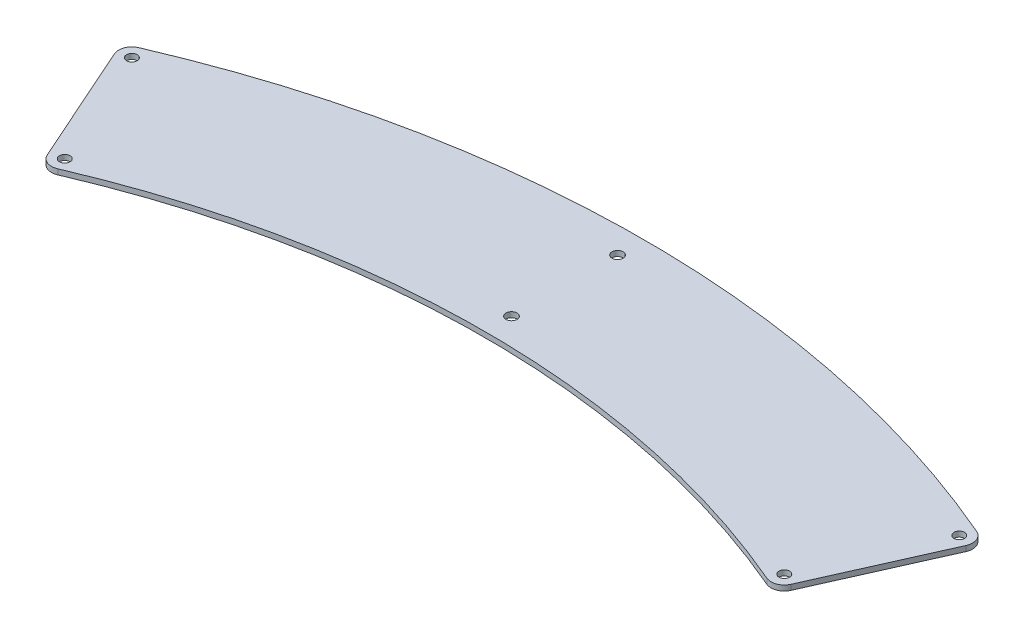
ISO-10303-21;
HEADER;
FILE_DESCRIPTION(('STEP AP214'),'2;1');
FILE_NAME('part.step','',(''),(''),'','','');
FILE_SCHEMA(('AUTOMOTIVE_DESIGN { 1 0 10303 214 1 1 1 1 }'));
ENDSEC;
DATA;
#1=APPLICATION_CONTEXT('core data for automotive mechanical design processes');
#2=APPLICATION_PROTOCOL_DEFINITION('international standard','automotive_design',2000,#1);
#3=PRODUCT_CONTEXT('',#1,'mechanical');
#4=PRODUCT('Part','Part','',(#3));
#5=PRODUCT_RELATED_PRODUCT_CATEGORY('part','',(#4));
#6=PRODUCT_DEFINITION_FORMATION('','',#4);
#7=PRODUCT_DEFINITION_CONTEXT('part definition',#1,'design');
#8=PRODUCT_DEFINITION('design','',#6,#7);
#9=PRODUCT_DEFINITION_SHAPE('','',#8);
#10=(LENGTH_UNIT() NAMED_UNIT(*) SI_UNIT(.MILLI.,.METRE.));
#11=(NAMED_UNIT(*) PLANE_ANGLE_UNIT() SI_UNIT($,.RADIAN.));
#12=(NAMED_UNIT(*) SI_UNIT($,.STERADIAN.) SOLID_ANGLE_UNIT());
#13=UNCERTAINTY_MEASURE_WITH_UNIT(LENGTH_MEASURE(1.E-05),#10,'distance_accuracy_value','');
#14=(GEOMETRIC_REPRESENTATION_CONTEXT(3) GLOBAL_UNCERTAINTY_ASSIGNED_CONTEXT((#13)) GLOBAL_UNIT_ASSIGNED_CONTEXT((#10,
#11,#12)) REPRESENTATION_CONTEXT('',''));
#15=CARTESIAN_POINT('',(0.,0.,0.));
#16=DIRECTION('',(0.,0.,1.));
#17=DIRECTION('',(1.,0.,0.));
#18=AXIS2_PLACEMENT_3D('',#15,#16,#17);
#19=CARTESIAN_POINT('',(0.,-2.,0.));
#20=DIRECTION('',(0.,1.,0.));
#21=DIRECTION('',(0.,0.,1.));
#22=AXIS2_PLACEMENT_3D('',#19,#20,#21);
#23=CYLINDRICAL_SURFACE('',#22,340.);
#24=CARTESIAN_POINT('',(0.,-2.,0.));
#25=DIRECTION('',(0.,-1.,0.));
#26=DIRECTION('',(0.,0.,1.));
#27=AXIS2_PLACEMENT_3D('',#24,#25,#26);
#28=CIRCLE('',#27,340.);
#29=CARTESIAN_POINT('',(-133.77440628349,-2.,-312.577043660439));
#30=VERTEX_POINT('',#29);
#31=CARTESIAN_POINT('',(133.77440628349,-2.,-312.577043660439));
#32=VERTEX_POINT('',#31);
#33=EDGE_CURVE('E160',#30,#32,#28,.T.);
#34=ORIENTED_EDGE('',*,*,#33,.T.);
#35=DIRECTION('',(0.,1.,0.));
#36=VECTOR('',#35,1.);
#37=CARTESIAN_POINT('',(133.77440628349,-2.,-312.577043660439));
#38=LINE('',#37,#36);
#39=CARTESIAN_POINT('',(133.77440628349,0.,-312.577043660439));
#40=VERTEX_POINT('',#39);
#41=EDGE_CURVE('E153',#32,#40,#38,.T.);
#42=ORIENTED_EDGE('',*,*,#41,.T.);
#43=CARTESIAN_POINT('',(0.,0.,0.));
#44=DIRECTION('',(0.,-1.,0.));
#45=DIRECTION('',(0.,0.,1.));
#46=AXIS2_PLACEMENT_3D('',#43,#44,#45);
#47=CIRCLE('',#46,340.);
#48=CARTESIAN_POINT('',(-133.77440628349,0.,-312.577043660439));
#49=VERTEX_POINT('',#48);
#50=EDGE_CURVE('E106',#49,#40,#47,.T.);
#51=ORIENTED_EDGE('',*,*,#50,.F.);
#52=DIRECTION('',(0.,1.,0.));
#53=VECTOR('',#52,1.);
#54=CARTESIAN_POINT('',(-133.77440628349,-2.,-312.577043660439));
#55=LINE('',#54,#53);
#56=EDGE_CURVE('E151',#49,#30,#55,.F.);
#57=ORIENTED_EDGE('',*,*,#56,.T.);
#58=EDGE_LOOP('',(#34,#42,#51,#57));
#59=FACE_BOUND('',#58,.T.);
#60=ADVANCED_FACE('F36',(#59),#23,.F.);
#61=CARTESIAN_POINT('',(-138.29045864577,-2.,-310.605455598485));
#62=DIRECTION('',(-0.913545457642601,0.,0.406736643075801));
#63=DIRECTION('',(0.406736643075801,0.,0.913545457642601));
#64=AXIS2_PLACEMENT_3D('',#61,#62,#63);
#65=PLANE('',#64);
#66=DIRECTION('',(0.406736643075801,0.,0.913545457642601));
#67=VECTOR('',#66,1.);
#68=CARTESIAN_POINT('',(-138.29045864577,0.,-310.605455598485));
#69=LINE('',#68,#67);
#70=CARTESIAN_POINT('',(-160.648102086543,0.,-360.8215449443));
#71=VERTEX_POINT('',#70);
#72=CARTESIAN_POINT('',(-140.309404252343,0.,-315.14008167536));
#73=VERTEX_POINT('',#72);
#74=EDGE_CURVE('E134',#71,#73,#69,.T.);
#75=ORIENTED_EDGE('',*,*,#74,.F.);
#76=DIRECTION('',(0.,1.,0.));
#77=VECTOR('',#76,1.);
#78=CARTESIAN_POINT('',(-160.648102086543,-2.,-360.8215449443));
#79=LINE('',#78,#77);
#80=CARTESIAN_POINT('',(-160.648102086543,-2.,-360.8215449443));
#81=VERTEX_POINT('',#80);
#82=EDGE_CURVE('E11',#71,#81,#79,.F.);
#83=ORIENTED_EDGE('',*,*,#82,.T.);
#84=DIRECTION('',(0.406736643075801,0.,0.913545457642601));
#85=VECTOR('',#84,1.);
#86=CARTESIAN_POINT('',(-138.29045864577,-2.,-310.605455598485));
#87=LINE('',#86,#85);
#88=CARTESIAN_POINT('',(-140.309404252343,-2.,-315.14008167536));
#89=VERTEX_POINT('',#88);
#90=EDGE_CURVE('E127',#81,#89,#87,.T.);
#91=ORIENTED_EDGE('',*,*,#90,.T.);
#92=DIRECTION('',(0.,1.,0.));
#93=VECTOR('',#92,1.);
#94=CARTESIAN_POINT('',(-140.309404252343,-2.,-315.14008167536));
#95=LINE('',#94,#93);
#96=EDGE_CURVE('E44',#89,#73,#95,.T.);
#97=ORIENTED_EDGE('',*,*,#96,.T.);
#98=EDGE_LOOP('',(#75,#83,#91,#97));
#99=FACE_BOUND('',#98,.T.);
#100=ADVANCED_FACE('F157',(#99),#65,.T.);
#101=CARTESIAN_POINT('',(0.,-2.,0.));
#102=DIRECTION('',(0.,1.,0.));
#103=DIRECTION('',(0.,0.,1.));
#104=AXIS2_PLACEMENT_3D('',#101,#102,#103);
#105=CYLINDRICAL_SURFACE('',#104,400.);
#106=CARTESIAN_POINT('',(0.,0.,0.));
#107=DIRECTION('',(0.,1.,0.));
#108=DIRECTION('',(0.,0.,1.));
#109=AXIS2_PLACEMENT_3D('',#106,#107,#108);
#110=CIRCLE('',#109,400.);
#111=CARTESIAN_POINT('',(158.056075745144,0.,-367.448332313599));
#112=VERTEX_POINT('',#111);
#113=CARTESIAN_POINT('',(-158.056075745144,0.,-367.448332313599));
#114=VERTEX_POINT('',#113);
#115=EDGE_CURVE('E122',#112,#114,#110,.T.);
#116=ORIENTED_EDGE('',*,*,#115,.F.);
#117=DIRECTION('',(0.,1.,0.));
#118=VECTOR('',#117,1.);
#119=CARTESIAN_POINT('',(158.056075745144,-2.,-367.448332313599));
#120=LINE('',#119,#118);
#121=CARTESIAN_POINT('',(158.056075745144,-2.,-367.448332313599));
#122=VERTEX_POINT('',#121);
#123=EDGE_CURVE('E143',#112,#122,#120,.F.);
#124=ORIENTED_EDGE('',*,*,#123,.T.);
#125=CARTESIAN_POINT('',(0.,-2.,0.));
#126=DIRECTION('',(0.,1.,0.));
#127=DIRECTION('',(0.,0.,1.));
#128=AXIS2_PLACEMENT_3D('',#125,#126,#127);
#129=CIRCLE('',#128,400.);
#130=CARTESIAN_POINT('',(-158.056075745144,-2.,-367.448332313599));
#131=VERTEX_POINT('',#130);
#132=EDGE_CURVE('E131',#122,#131,#129,.T.);
#133=ORIENTED_EDGE('',*,*,#132,.T.);
#134=DIRECTION('',(0.,1.,0.));
#135=VECTOR('',#134,1.);
#136=CARTESIAN_POINT('',(-158.056075745144,-2.,-367.448332313599));
#137=LINE('',#136,#135);
#138=EDGE_CURVE('E140',#131,#114,#137,.T.);
#139=ORIENTED_EDGE('',*,*,#138,.T.);
#140=EDGE_LOOP('',(#116,#124,#133,#139));
#141=FACE_BOUND('',#140,.T.);
#142=ADVANCED_FACE('F242',(#141),#105,.T.);
#143=CARTESIAN_POINT('',(162.694657230318,-2.,-365.418183057042));
#144=DIRECTION('',(0.913545457642603,0.,0.406736643075795));
#145=DIRECTION('',(0.406736643075795,0.,-0.913545457642603));
#146=AXIS2_PLACEMENT_3D('',#143,#144,#145);
#147=PLANE('',#146);
#148=DIRECTION('',(0.406736643075795,0.,-0.913545457642603));
#149=VECTOR('',#148,1.);
#150=CARTESIAN_POINT('',(162.694657230318,-2.,-365.418183057042));
#151=LINE('',#150,#149);
#152=CARTESIAN_POINT('',(140.309404252343,-2.,-315.14008167536));
#153=VERTEX_POINT('',#152);
#154=CARTESIAN_POINT('',(160.648102086543,-2.,-360.8215449443));
#155=VERTEX_POINT('',#154);
#156=EDGE_CURVE('E162',#153,#155,#151,.T.);
#157=ORIENTED_EDGE('',*,*,#156,.T.);
#158=DIRECTION('',(0.,1.,0.));
#159=VECTOR('',#158,1.);
#160=CARTESIAN_POINT('',(160.648102086543,-2.,-360.8215449443));
#161=LINE('',#160,#159);
#162=CARTESIAN_POINT('',(160.648102086543,0.,-360.8215449443));
#163=VERTEX_POINT('',#162);
#164=EDGE_CURVE('E121',#155,#163,#161,.T.);
#165=ORIENTED_EDGE('',*,*,#164,.T.);
#166=DIRECTION('',(0.406736643075795,0.,-0.913545457642603));
#167=VECTOR('',#166,1.);
#168=CARTESIAN_POINT('',(162.694657230318,0.,-365.418183057042));
#169=LINE('',#168,#167);
#170=CARTESIAN_POINT('',(140.309404252343,0.,-315.14008167536));
#171=VERTEX_POINT('',#170);
#172=EDGE_CURVE('E104',#171,#163,#169,.T.);
#173=ORIENTED_EDGE('',*,*,#172,.F.);
#174=DIRECTION('',(0.,1.,0.));
#175=VECTOR('',#174,1.);
#176=CARTESIAN_POINT('',(140.309404252343,-2.,-315.14008167536));
#177=LINE('',#176,#175);
#178=EDGE_CURVE('E118',#171,#153,#177,.F.);
#179=ORIENTED_EDGE('',*,*,#178,.T.);
#180=EDGE_LOOP('',(#157,#165,#173,#179));
#181=FACE_BOUND('',#180,.T.);
#182=ADVANCED_FACE('F117',(#181),#147,.T.);
#183=CARTESIAN_POINT('',(0.,-2.,0.));
#184=DIRECTION('',(0.,1.,0.));
#185=DIRECTION('',(0.,0.,1.));
#186=AXIS2_PLACEMENT_3D('',#183,#184,#185);
#187=PLANE('',#186);
#188=CARTESIAN_POINT('',(156.08037479833,-2.,-362.855228159679));
#189=DIRECTION('',(0.,1.,0.));
#190=DIRECTION('',(0.,0.,1.));
#191=AXIS2_PLACEMENT_3D('',#188,#189,#190);
#192=CIRCLE('',#191,2.);
#193=CARTESIAN_POINT('',(156.08037479833,-2.,-360.855228159679));
#194=VERTEX_POINT('',#193);
#195=EDGE_CURVE('E200',#194,#194,#192,.T.);
#196=ORIENTED_EDGE('',*,*,#195,.T.);
#197=EDGE_LOOP('',(#196));
#198=FACE_BOUND('',#197,.T.);
#199=CARTESIAN_POINT('',(135.74167696413,-2.,-317.173764890739));
#200=DIRECTION('',(0.,1.,0.));
#201=DIRECTION('',(0.,0.,1.));
#202=AXIS2_PLACEMENT_3D('',#199,#200,#201);
#203=CIRCLE('',#202,2.);
#204=CARTESIAN_POINT('',(135.74167696413,-2.,-315.173764890739));
#205=VERTEX_POINT('',#204);
#206=EDGE_CURVE('E194',#205,#205,#203,.T.);
#207=ORIENTED_EDGE('',*,*,#206,.T.);
#208=EDGE_LOOP('',(#207));
#209=FACE_BOUND('',#208,.T.);
#210=CARTESIAN_POINT('',(-156.08037479833,-2.,-362.855228159679));
#211=DIRECTION('',(0.,1.,0.));
#212=DIRECTION('',(0.,0.,1.));
#213=AXIS2_PLACEMENT_3D('',#210,#211,#212);
#214=CIRCLE('',#213,2.);
#215=CARTESIAN_POINT('',(-156.08037479833,-2.,-360.855228159679));
#216=VERTEX_POINT('',#215);
#217=EDGE_CURVE('E188',#216,#216,#214,.T.);
#218=ORIENTED_EDGE('',*,*,#217,.T.);
#219=EDGE_LOOP('',(#218));
#220=FACE_BOUND('',#219,.T.);
#221=CARTESIAN_POINT('',(-135.741676964129,-2.,-317.173764890739));
#222=DIRECTION('',(0.,1.,0.));
#223=DIRECTION('',(0.,0.,1.));
#224=AXIS2_PLACEMENT_3D('',#221,#222,#223);
#225=CIRCLE('',#224,2.);
#226=CARTESIAN_POINT('',(-135.741676964129,-2.,-315.173764890739));
#227=VERTEX_POINT('',#226);
#228=EDGE_CURVE('E182',#227,#227,#225,.T.);
#229=ORIENTED_EDGE('',*,*,#228,.T.);
#230=EDGE_LOOP('',(#229));
#231=FACE_BOUND('',#230,.T.);
#232=CARTESIAN_POINT('',(0.,-2.,-390.));
#233=DIRECTION('',(0.,1.,0.));
#234=DIRECTION('',(0.,0.,1.));
#235=AXIS2_PLACEMENT_3D('',#232,#233,#234);
#236=CIRCLE('',#235,2.09999999999999);
#237=CARTESIAN_POINT('',(0.,-2.,-387.9));
#238=VERTEX_POINT('',#237);
#239=EDGE_CURVE('E176',#238,#238,#236,.T.);
#240=ORIENTED_EDGE('',*,*,#239,.T.);
#241=EDGE_LOOP('',(#240));
#242=FACE_BOUND('',#241,.T.);
#243=CARTESIAN_POINT('',(0.,-2.,-350.));
#244=DIRECTION('',(0.,1.,0.));
#245=DIRECTION('',(0.,0.,1.));
#246=AXIS2_PLACEMENT_3D('',#243,#244,#245);
#247=CIRCLE('',#246,2.10000000000001);
#248=CARTESIAN_POINT('',(0.,-2.,-347.9));
#249=VERTEX_POINT('',#248);
#250=EDGE_CURVE('E166',#249,#249,#247,.T.);
#251=ORIENTED_EDGE('',*,*,#250,.T.);
#252=EDGE_LOOP('',(#251));
#253=FACE_BOUND('',#252,.T.);
#254=ORIENTED_EDGE('',*,*,#132,.F.);
#255=CARTESIAN_POINT('',(156.08037479833,-2.,-362.855228159679));
#256=DIRECTION('',(0.,1.,0.));
#257=DIRECTION('',(0.,0.,1.));
#258=AXIS2_PLACEMENT_3D('',#255,#256,#257);
#259=CIRCLE('',#258,5.);
#260=EDGE_CURVE('E149',#122,#155,#259,.F.);
#261=ORIENTED_EDGE('',*,*,#260,.T.);
#262=ORIENTED_EDGE('',*,*,#156,.F.);
#263=CARTESIAN_POINT('',(135.74167696413,-2.,-317.173764890739));
#264=DIRECTION('',(0.,1.,0.));
#265=DIRECTION('',(0.,0.,1.));
#266=AXIS2_PLACEMENT_3D('',#263,#264,#265);
#267=CIRCLE('',#266,5.);
#268=EDGE_CURVE('E126',#153,#32,#267,.F.);
#269=ORIENTED_EDGE('',*,*,#268,.T.);
#270=ORIENTED_EDGE('',*,*,#33,.F.);
#271=CARTESIAN_POINT('',(-135.74167696413,-2.,-317.173764890739));
#272=DIRECTION('',(0.,1.,0.));
#273=DIRECTION('',(0.,0.,1.));
#274=AXIS2_PLACEMENT_3D('',#271,#272,#273);
#275=CIRCLE('',#274,5.);
#276=EDGE_CURVE('E51',#30,#89,#275,.F.);
#277=ORIENTED_EDGE('',*,*,#276,.T.);
#278=ORIENTED_EDGE('',*,*,#90,.F.);
#279=CARTESIAN_POINT('',(-156.08037479833,-2.,-362.855228159679));
#280=DIRECTION('',(0.,1.,0.));
#281=DIRECTION('',(0.,0.,1.));
#282=AXIS2_PLACEMENT_3D('',#279,#280,#281);
#283=CIRCLE('',#282,5.);
#284=EDGE_CURVE('E146',#81,#131,#283,.F.);
#285=ORIENTED_EDGE('',*,*,#284,.T.);
#286=EDGE_LOOP('',(#254,#261,#262,#269,#270,#277,#278,#285));
#287=FACE_BOUND('',#286,.T.);
#288=ADVANCED_FACE('F213',(#198,#209,#220,#231,#242,#253,#287),#187,.F.);
#289=CARTESIAN_POINT('',(0.,0.,0.));
#290=DIRECTION('',(0.,1.,0.));
#291=DIRECTION('',(0.,0.,1.));
#292=AXIS2_PLACEMENT_3D('',#289,#290,#291);
#293=PLANE('',#292);
#294=CARTESIAN_POINT('',(156.08037479833,0.,-362.855228159679));
#295=DIRECTION('',(0.,1.,0.));
#296=DIRECTION('',(0.,0.,1.));
#297=AXIS2_PLACEMENT_3D('',#294,#295,#296);
#298=CIRCLE('',#297,2.);
#299=CARTESIAN_POINT('',(156.08037479833,0.,-360.855228159679));
#300=VERTEX_POINT('',#299);
#301=EDGE_CURVE('E203',#300,#300,#298,.T.);
#302=ORIENTED_EDGE('',*,*,#301,.F.);
#303=EDGE_LOOP('',(#302));
#304=FACE_BOUND('',#303,.T.);
#305=CARTESIAN_POINT('',(135.74167696413,0.,-317.173764890739));
#306=DIRECTION('',(0.,1.,0.));
#307=DIRECTION('',(0.,0.,1.));
#308=AXIS2_PLACEMENT_3D('',#305,#306,#307);
#309=CIRCLE('',#308,2.);
#310=CARTESIAN_POINT('',(135.74167696413,0.,-315.173764890739));
#311=VERTEX_POINT('',#310);
#312=EDGE_CURVE('E197',#311,#311,#309,.T.);
#313=ORIENTED_EDGE('',*,*,#312,.F.);
#314=EDGE_LOOP('',(#313));
#315=FACE_BOUND('',#314,.T.);
#316=CARTESIAN_POINT('',(-156.08037479833,0.,-362.855228159679));
#317=DIRECTION('',(0.,1.,0.));
#318=DIRECTION('',(0.,0.,1.));
#319=AXIS2_PLACEMENT_3D('',#316,#317,#318);
#320=CIRCLE('',#319,2.);
#321=CARTESIAN_POINT('',(-156.08037479833,0.,-360.855228159679));
#322=VERTEX_POINT('',#321);
#323=EDGE_CURVE('E191',#322,#322,#320,.T.);
#324=ORIENTED_EDGE('',*,*,#323,.F.);
#325=EDGE_LOOP('',(#324));
#326=FACE_BOUND('',#325,.T.);
#327=CARTESIAN_POINT('',(-135.741676964129,0.,-317.173764890739));
#328=DIRECTION('',(0.,1.,0.));
#329=DIRECTION('',(0.,0.,1.));
#330=AXIS2_PLACEMENT_3D('',#327,#328,#329);
#331=CIRCLE('',#330,2.);
#332=CARTESIAN_POINT('',(-135.741676964129,0.,-315.173764890739));
#333=VERTEX_POINT('',#332);
#334=EDGE_CURVE('E185',#333,#333,#331,.T.);
#335=ORIENTED_EDGE('',*,*,#334,.F.);
#336=EDGE_LOOP('',(#335));
#337=FACE_BOUND('',#336,.T.);
#338=CARTESIAN_POINT('',(0.,0.,-390.));
#339=DIRECTION('',(0.,1.,0.));
#340=DIRECTION('',(0.,0.,1.));
#341=AXIS2_PLACEMENT_3D('',#338,#339,#340);
#342=CIRCLE('',#341,2.09999999999999);
#343=CARTESIAN_POINT('',(0.,0.,-387.9));
#344=VERTEX_POINT('',#343);
#345=EDGE_CURVE('E179',#344,#344,#342,.T.);
#346=ORIENTED_EDGE('',*,*,#345,.F.);
#347=EDGE_LOOP('',(#346));
#348=FACE_BOUND('',#347,.T.);
#349=CARTESIAN_POINT('',(0.,0.,-350.));
#350=DIRECTION('',(0.,1.,0.));
#351=DIRECTION('',(0.,0.,1.));
#352=AXIS2_PLACEMENT_3D('',#349,#350,#351);
#353=CIRCLE('',#352,2.10000000000001);
#354=CARTESIAN_POINT('',(0.,0.,-347.9));
#355=VERTEX_POINT('',#354);
#356=EDGE_CURVE('E173',#355,#355,#353,.T.);
#357=ORIENTED_EDGE('',*,*,#356,.F.);
#358=EDGE_LOOP('',(#357));
#359=FACE_BOUND('',#358,.T.);
#360=ORIENTED_EDGE('',*,*,#172,.T.);
#361=CARTESIAN_POINT('',(156.08037479833,0.,-362.855228159679));
#362=DIRECTION('',(0.,1.,0.));
#363=DIRECTION('',(0.,0.,1.));
#364=AXIS2_PLACEMENT_3D('',#361,#362,#363);
#365=CIRCLE('',#364,5.);
#366=EDGE_CURVE('E111',#163,#112,#365,.T.);
#367=ORIENTED_EDGE('',*,*,#366,.T.);
#368=ORIENTED_EDGE('',*,*,#115,.T.);
#369=CARTESIAN_POINT('',(-156.08037479833,0.,-362.855228159679));
#370=DIRECTION('',(0.,1.,0.));
#371=DIRECTION('',(0.,0.,1.));
#372=AXIS2_PLACEMENT_3D('',#369,#370,#371);
#373=CIRCLE('',#372,5.);
#374=EDGE_CURVE('E112',#114,#71,#373,.T.);
#375=ORIENTED_EDGE('',*,*,#374,.T.);
#376=ORIENTED_EDGE('',*,*,#74,.T.);
#377=CARTESIAN_POINT('',(-135.74167696413,0.,-317.173764890739));
#378=DIRECTION('',(0.,1.,0.));
#379=DIRECTION('',(0.,0.,1.));
#380=AXIS2_PLACEMENT_3D('',#377,#378,#379);
#381=CIRCLE('',#380,5.);
#382=EDGE_CURVE('E129',#73,#49,#381,.T.);
#383=ORIENTED_EDGE('',*,*,#382,.T.);
#384=ORIENTED_EDGE('',*,*,#50,.T.);
#385=CARTESIAN_POINT('',(135.74167696413,0.,-317.173764890739));
#386=DIRECTION('',(0.,1.,0.));
#387=DIRECTION('',(0.,0.,1.));
#388=AXIS2_PLACEMENT_3D('',#385,#386,#387);
#389=CIRCLE('',#388,5.);
#390=EDGE_CURVE('E101',#40,#171,#389,.T.);
#391=ORIENTED_EDGE('',*,*,#390,.T.);
#392=EDGE_LOOP('',(#360,#367,#368,#375,#376,#383,#384,#391));
#393=FACE_BOUND('',#392,.T.);
#394=ADVANCED_FACE('F103',(#304,#315,#326,#337,#348,#359,#393),#293,.T.);
#395=CARTESIAN_POINT('',(156.08037479833,-2.,-362.855228159679));
#396=DIRECTION('',(0.,1.,0.));
#397=DIRECTION('',(0.,0.,1.));
#398=AXIS2_PLACEMENT_3D('',#395,#396,#397);
#399=CYLINDRICAL_SURFACE('',#398,5.);
#400=ORIENTED_EDGE('',*,*,#260,.F.);
#401=ORIENTED_EDGE('',*,*,#123,.F.);
#402=ORIENTED_EDGE('',*,*,#366,.F.);
#403=ORIENTED_EDGE('',*,*,#164,.F.);
#404=EDGE_LOOP('',(#400,#401,#402,#403));
#405=FACE_BOUND('',#404,.T.);
#406=ADVANCED_FACE('F212',(#405),#399,.T.);
#407=CARTESIAN_POINT('',(135.74167696413,-2.,-317.173764890739));
#408=DIRECTION('',(0.,1.,0.));
#409=DIRECTION('',(0.,0.,1.));
#410=AXIS2_PLACEMENT_3D('',#407,#408,#409);
#411=CYLINDRICAL_SURFACE('',#410,5.);
#412=ORIENTED_EDGE('',*,*,#268,.F.);
#413=ORIENTED_EDGE('',*,*,#178,.F.);
#414=ORIENTED_EDGE('',*,*,#390,.F.);
#415=ORIENTED_EDGE('',*,*,#41,.F.);
#416=EDGE_LOOP('',(#412,#413,#414,#415));
#417=FACE_BOUND('',#416,.T.);
#418=ADVANCED_FACE('F125',(#417),#411,.T.);
#419=CARTESIAN_POINT('',(-156.08037479833,-2.,-362.855228159679));
#420=DIRECTION('',(0.,1.,0.));
#421=DIRECTION('',(0.,0.,1.));
#422=AXIS2_PLACEMENT_3D('',#419,#420,#421);
#423=CYLINDRICAL_SURFACE('',#422,5.);
#424=ORIENTED_EDGE('',*,*,#284,.F.);
#425=ORIENTED_EDGE('',*,*,#82,.F.);
#426=ORIENTED_EDGE('',*,*,#374,.F.);
#427=ORIENTED_EDGE('',*,*,#138,.F.);
#428=EDGE_LOOP('',(#424,#425,#426,#427));
#429=FACE_BOUND('',#428,.T.);
#430=ADVANCED_FACE('F244',(#429),#423,.T.);
#431=CARTESIAN_POINT('',(-135.74167696413,-2.,-317.173764890739));
#432=DIRECTION('',(0.,1.,0.));
#433=DIRECTION('',(0.,0.,1.));
#434=AXIS2_PLACEMENT_3D('',#431,#432,#433);
#435=CYLINDRICAL_SURFACE('',#434,5.);
#436=ORIENTED_EDGE('',*,*,#276,.F.);
#437=ORIENTED_EDGE('',*,*,#56,.F.);
#438=ORIENTED_EDGE('',*,*,#382,.F.);
#439=ORIENTED_EDGE('',*,*,#96,.F.);
#440=EDGE_LOOP('',(#436,#437,#438,#439));
#441=FACE_BOUND('',#440,.T.);
#442=ADVANCED_FACE('F38',(#441),#435,.T.);
#443=CARTESIAN_POINT('',(0.,-10.,-350.));
#444=DIRECTION('',(0.,1.,0.));
#445=DIRECTION('',(0.,0.,1.));
#446=AXIS2_PLACEMENT_3D('',#443,#444,#445);
#447=CYLINDRICAL_SURFACE('',#446,2.10000000000001);
#448=ORIENTED_EDGE('',*,*,#356,.T.);
#449=EDGE_LOOP('',(#448));
#450=FACE_BOUND('',#449,.T.);
#451=ORIENTED_EDGE('',*,*,#250,.F.);
#452=EDGE_LOOP('',(#451));
#453=FACE_BOUND('',#452,.T.);
#454=ADVANCED_FACE('F225',(#450,#453),#447,.F.);
#455=CARTESIAN_POINT('',(0.,-10.,-390.));
#456=DIRECTION('',(0.,1.,0.));
#457=DIRECTION('',(0.,0.,1.));
#458=AXIS2_PLACEMENT_3D('',#455,#456,#457);
#459=CYLINDRICAL_SURFACE('',#458,2.09999999999999);
#460=ORIENTED_EDGE('',*,*,#345,.T.);
#461=EDGE_LOOP('',(#460));
#462=FACE_BOUND('',#461,.T.);
#463=ORIENTED_EDGE('',*,*,#239,.F.);
#464=EDGE_LOOP('',(#463));
#465=FACE_BOUND('',#464,.T.);
#466=ADVANCED_FACE('F228',(#462,#465),#459,.F.);
#467=CARTESIAN_POINT('',(-135.741676964129,-10.,-317.173764890739));
#468=DIRECTION('',(0.,1.,0.));
#469=DIRECTION('',(0.,0.,1.));
#470=AXIS2_PLACEMENT_3D('',#467,#468,#469);
#471=CYLINDRICAL_SURFACE('',#470,2.);
#472=ORIENTED_EDGE('',*,*,#334,.T.);
#473=EDGE_LOOP('',(#472));
#474=FACE_BOUND('',#473,.T.);
#475=ORIENTED_EDGE('',*,*,#228,.F.);
#476=EDGE_LOOP('',(#475));
#477=FACE_BOUND('',#476,.T.);
#478=ADVANCED_FACE('F296',(#474,#477),#471,.F.);
#479=CARTESIAN_POINT('',(-156.08037479833,-10.,-362.855228159679));
#480=DIRECTION('',(0.,1.,0.));
#481=DIRECTION('',(0.,0.,1.));
#482=AXIS2_PLACEMENT_3D('',#479,#480,#481);
#483=CYLINDRICAL_SURFACE('',#482,2.);
#484=ORIENTED_EDGE('',*,*,#323,.T.);
#485=EDGE_LOOP('',(#484));
#486=FACE_BOUND('',#485,.T.);
#487=ORIENTED_EDGE('',*,*,#217,.F.);
#488=EDGE_LOOP('',(#487));
#489=FACE_BOUND('',#488,.T.);
#490=ADVANCED_FACE('F320',(#486,#489),#483,.F.);
#491=CARTESIAN_POINT('',(135.74167696413,-10.,-317.173764890739));
#492=DIRECTION('',(0.,1.,0.));
#493=DIRECTION('',(0.,0.,1.));
#494=AXIS2_PLACEMENT_3D('',#491,#492,#493);
#495=CYLINDRICAL_SURFACE('',#494,2.);
#496=ORIENTED_EDGE('',*,*,#312,.T.);
#497=EDGE_LOOP('',(#496));
#498=FACE_BOUND('',#497,.T.);
#499=ORIENTED_EDGE('',*,*,#206,.F.);
#500=EDGE_LOOP('',(#499));
#501=FACE_BOUND('',#500,.T.);
#502=ADVANCED_FACE('F330',(#498,#501),#495,.F.);
#503=CARTESIAN_POINT('',(156.08037479833,-10.,-362.855228159679));
#504=DIRECTION('',(0.,1.,0.));
#505=DIRECTION('',(0.,0.,1.));
#506=AXIS2_PLACEMENT_3D('',#503,#504,#505);
#507=CYLINDRICAL_SURFACE('',#506,2.);
#508=ORIENTED_EDGE('',*,*,#301,.T.);
#509=EDGE_LOOP('',(#508));
#510=FACE_BOUND('',#509,.T.);
#511=ORIENTED_EDGE('',*,*,#195,.F.);
#512=EDGE_LOOP('',(#511));
#513=FACE_BOUND('',#512,.T.);
#514=ADVANCED_FACE('F207',(#510,#513),#507,.F.);
#515=CLOSED_SHELL('',(#60,#100,#142,#182,#288,#394,#406,#418,#430,#442,#454,#466,#478,#490,#502,#514));
#516=MANIFOLD_SOLID_BREP('B2',#515);
#517=ADVANCED_BREP_SHAPE_REPRESENTATION('',(#18,#516),#14);
#518=SHAPE_DEFINITION_REPRESENTATION(#9,#517);
ENDSEC;
END-ISO-10303-21;
